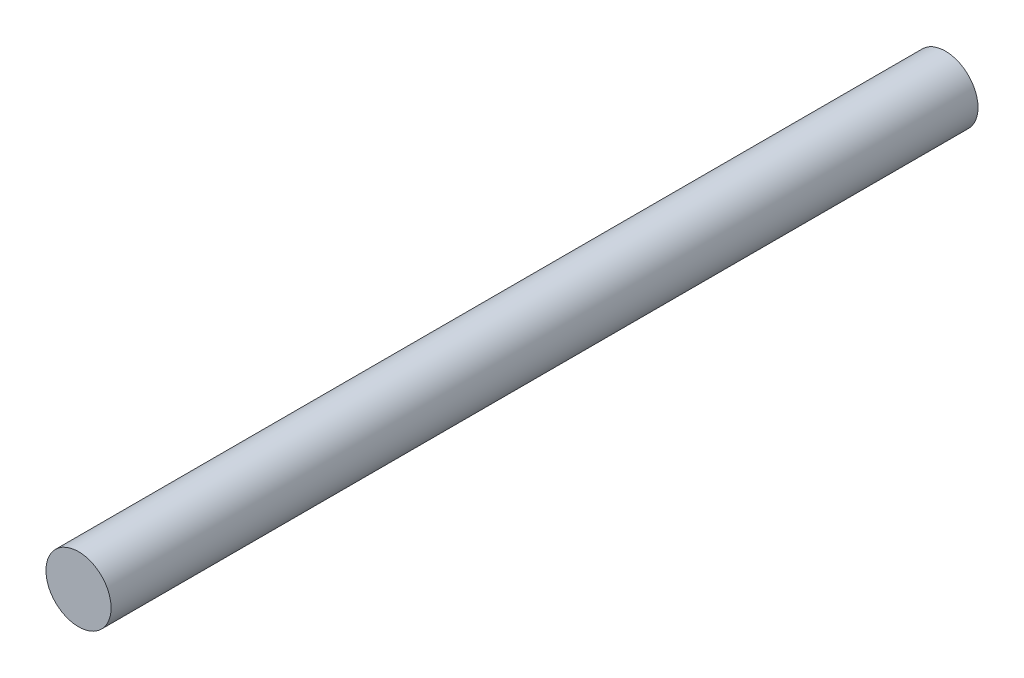
ISO-10303-21;
HEADER;
FILE_DESCRIPTION(('STEP AP214'),'2;1');
FILE_NAME('part.step','',(''),(''),'','','');
FILE_SCHEMA(('AUTOMOTIVE_DESIGN { 1 0 10303 214 1 1 1 1 }'));
ENDSEC;
DATA;
#1=APPLICATION_CONTEXT('core data for automotive mechanical design processes');
#2=APPLICATION_PROTOCOL_DEFINITION('international standard','automotive_design',2000,#1);
#3=PRODUCT_CONTEXT('',#1,'mechanical');
#4=PRODUCT('Part','Part','',(#3));
#5=PRODUCT_RELATED_PRODUCT_CATEGORY('part','',(#4));
#6=PRODUCT_DEFINITION_FORMATION('','',#4);
#7=PRODUCT_DEFINITION_CONTEXT('part definition',#1,'design');
#8=PRODUCT_DEFINITION('design','',#6,#7);
#9=PRODUCT_DEFINITION_SHAPE('','',#8);
#10=(LENGTH_UNIT() NAMED_UNIT(*) SI_UNIT(.MILLI.,.METRE.));
#11=(NAMED_UNIT(*) PLANE_ANGLE_UNIT() SI_UNIT($,.RADIAN.));
#12=(NAMED_UNIT(*) SI_UNIT($,.STERADIAN.) SOLID_ANGLE_UNIT());
#13=UNCERTAINTY_MEASURE_WITH_UNIT(LENGTH_MEASURE(1.E-05),#10,'distance_accuracy_value','');
#14=(GEOMETRIC_REPRESENTATION_CONTEXT(3) GLOBAL_UNCERTAINTY_ASSIGNED_CONTEXT((#13)) GLOBAL_UNIT_ASSIGNED_CONTEXT((#10,
#11,#12)) REPRESENTATION_CONTEXT('',''));
#15=CARTESIAN_POINT('',(0.,0.,0.));
#16=DIRECTION('',(0.,0.,1.));
#17=DIRECTION('',(1.,0.,0.));
#18=AXIS2_PLACEMENT_3D('',#15,#16,#17);
#19=CARTESIAN_POINT('',(0.0522885789394772,0.183010026288174,86.5));
#20=DIRECTION('',(0.,0.,-1.));
#21=DIRECTION('',(-1.,0.,0.));
#22=AXIS2_PLACEMENT_3D('',#19,#20,#21);
#23=CYLINDRICAL_SURFACE('',#22,3.25);
#24=CARTESIAN_POINT('',(0.0522885789394772,0.183010026288174,86.5));
#25=DIRECTION('',(0.,0.,1.));
#26=DIRECTION('',(1.,0.,0.));
#27=AXIS2_PLACEMENT_3D('',#24,#25,#26);
#28=CIRCLE('',#27,3.25);
#29=CARTESIAN_POINT('',(3.30228857893948,0.183010026288174,86.5));
#30=VERTEX_POINT('',#29);
#31=EDGE_CURVE('E10',#30,#30,#28,.T.);
#32=ORIENTED_EDGE('',*,*,#31,.F.);
#33=EDGE_LOOP('',(#32));
#34=FACE_BOUND('',#33,.T.);
#35=CARTESIAN_POINT('',(0.0522885789394772,0.183010026288174,0.));
#36=DIRECTION('',(0.,0.,1.));
#37=DIRECTION('',(1.,0.,0.));
#38=AXIS2_PLACEMENT_3D('',#35,#36,#37);
#39=CIRCLE('',#38,3.25);
#40=CARTESIAN_POINT('',(3.30228857893948,0.183010026288174,0.));
#41=VERTEX_POINT('',#40);
#42=EDGE_CURVE('E40',#41,#41,#39,.T.);
#43=ORIENTED_EDGE('',*,*,#42,.T.);
#44=EDGE_LOOP('',(#43));
#45=FACE_BOUND('',#44,.T.);
#46=ADVANCED_FACE('F37',(#34,#45),#23,.T.);
#47=CARTESIAN_POINT('',(0.0522885789394772,0.183010026288174,86.5));
#48=DIRECTION('',(0.,0.,1.));
#49=DIRECTION('',(1.,0.,0.));
#50=AXIS2_PLACEMENT_3D('',#47,#48,#49);
#51=PLANE('',#50);
#52=ORIENTED_EDGE('',*,*,#31,.T.);
#53=EDGE_LOOP('',(#52));
#54=FACE_BOUND('',#53,.T.);
#55=ADVANCED_FACE('F54',(#54),#51,.T.);
#56=CARTESIAN_POINT('',(0.0522885789394772,0.183010026288174,0.));
#57=DIRECTION('',(0.,0.,1.));
#58=DIRECTION('',(1.,0.,0.));
#59=AXIS2_PLACEMENT_3D('',#56,#57,#58);
#60=PLANE('',#59);
#61=ORIENTED_EDGE('',*,*,#42,.F.);
#62=EDGE_LOOP('',(#61));
#63=FACE_BOUND('',#62,.T.);
#64=ADVANCED_FACE('F52',(#63),#60,.F.);
#65=CLOSED_SHELL('',(#46,#55,#64));
#66=MANIFOLD_SOLID_BREP('B2',#65);
#67=ADVANCED_BREP_SHAPE_REPRESENTATION('',(#18,#66),#14);
#68=SHAPE_DEFINITION_REPRESENTATION(#9,#67);
ENDSEC;
END-ISO-10303-21;
